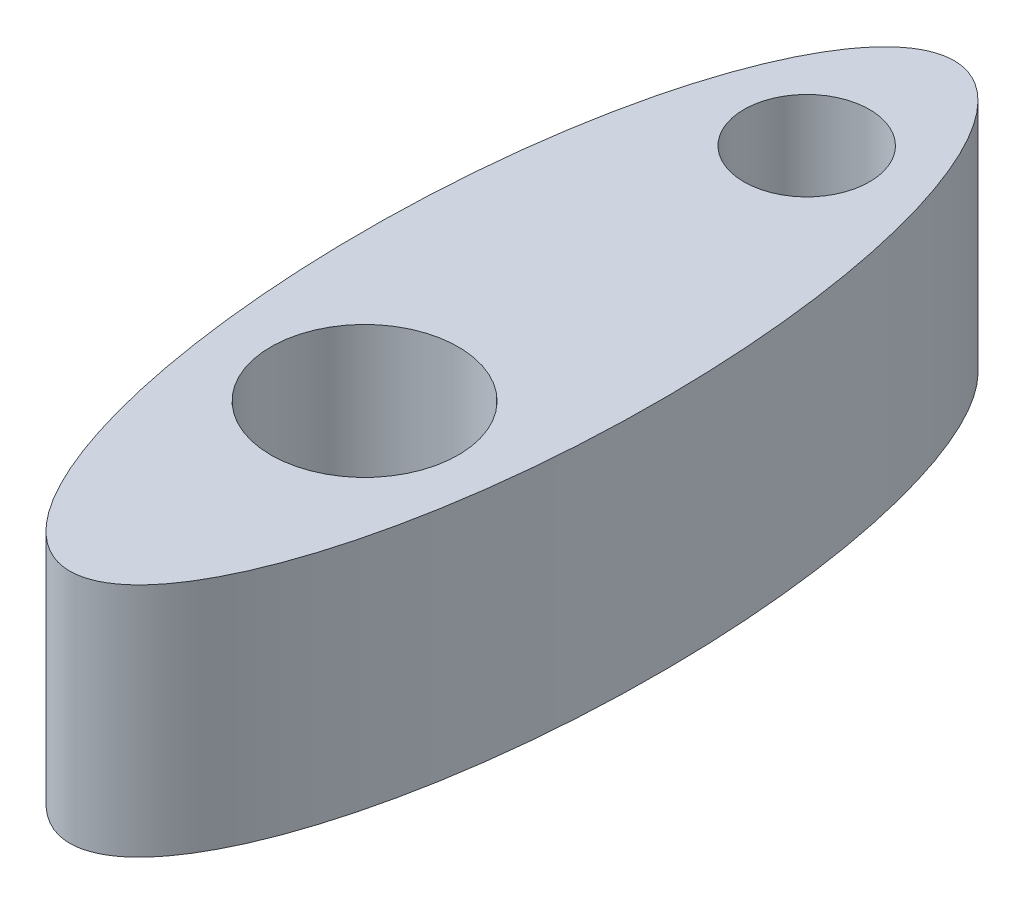
ISO-10303-21;
HEADER;
FILE_DESCRIPTION(('STEP AP214'),'2;1');
FILE_NAME('part.step','',(''),(''),'','','');
FILE_SCHEMA(('AUTOMOTIVE_DESIGN { 1 0 10303 214 1 1 1 1 }'));
ENDSEC;
DATA;
#1=APPLICATION_CONTEXT('core data for automotive mechanical design processes');
#2=APPLICATION_PROTOCOL_DEFINITION('international standard','automotive_design',2000,#1);
#3=PRODUCT_CONTEXT('',#1,'mechanical');
#4=PRODUCT('Part','Part','',(#3));
#5=PRODUCT_RELATED_PRODUCT_CATEGORY('part','',(#4));
#6=PRODUCT_DEFINITION_FORMATION('','',#4);
#7=PRODUCT_DEFINITION_CONTEXT('part definition',#1,'design');
#8=PRODUCT_DEFINITION('design','',#6,#7);
#9=PRODUCT_DEFINITION_SHAPE('','',#8);
#10=(LENGTH_UNIT() NAMED_UNIT(*) SI_UNIT(.MILLI.,.METRE.));
#11=(NAMED_UNIT(*) PLANE_ANGLE_UNIT() SI_UNIT($,.RADIAN.));
#12=(NAMED_UNIT(*) SI_UNIT($,.STERADIAN.) SOLID_ANGLE_UNIT());
#13=UNCERTAINTY_MEASURE_WITH_UNIT(LENGTH_MEASURE(1.E-05),#10,'distance_accuracy_value','');
#14=(GEOMETRIC_REPRESENTATION_CONTEXT(3) GLOBAL_UNCERTAINTY_ASSIGNED_CONTEXT((#13)) GLOBAL_UNIT_ASSIGNED_CONTEXT((#10,
#11,#12)) REPRESENTATION_CONTEXT('',''));
#15=CARTESIAN_POINT('',(0.,0.,0.));
#16=DIRECTION('',(0.,0.,1.));
#17=DIRECTION('',(1.,0.,0.));
#18=AXIS2_PLACEMENT_3D('',#15,#16,#17);
#19=CARTESIAN_POINT('',(0.,5.08,0.));
#20=DIRECTION('',(0.,1.,0.));
#21=DIRECTION('',(0.,0.,1.));
#22=AXIS2_PLACEMENT_3D('',#19,#20,#21);
#23=PLANE('',#22);
#24=CARTESIAN_POINT('',(0.,5.08,0.));
#25=DIRECTION('',(0.,1.,0.));
#26=DIRECTION('',(0.,0.,1.));
#27=AXIS2_PLACEMENT_3D('',#24,#25,#26);
#28=CIRCLE('',#27,2.01929999999999);
#29=CARTESIAN_POINT('',(0.,5.08,2.01929999999999));
#30=VERTEX_POINT('',#29);
#31=EDGE_CURVE('E41',#30,#30,#28,.T.);
#32=ORIENTED_EDGE('',*,*,#31,.F.);
#33=EDGE_LOOP('',(#32));
#34=FACE_BOUND('',#33,.T.);
#35=CARTESIAN_POINT('',(0.,5.08,-9.525));
#36=DIRECTION('',(0.,1.,0.));
#37=DIRECTION('',(0.,0.,1.));
#38=AXIS2_PLACEMENT_3D('',#35,#36,#37);
#39=CIRCLE('',#38,1.35255);
#40=CARTESIAN_POINT('',(0.,5.08,-8.17245));
#41=VERTEX_POINT('',#40);
#42=EDGE_CURVE('E49',#41,#41,#39,.T.);
#43=ORIENTED_EDGE('',*,*,#42,.F.);
#44=EDGE_LOOP('',(#43));
#45=FACE_BOUND('',#44,.T.);
#46=CARTESIAN_POINT('',(0.,5.08,-3.175));
#47=DIRECTION('',(0.,1.,0.));
#48=DIRECTION('',(0.,0.,1.));
#49=AXIS2_PLACEMENT_3D('',#46,#47,#48);
#50=ELLIPSE('',#49,9.525,3.175);
#51=CARTESIAN_POINT('',(0.,5.08,6.35));
#52=VERTEX_POINT('',#51);
#53=EDGE_CURVE('E55',#52,#52,#50,.T.);
#54=ORIENTED_EDGE('',*,*,#53,.T.);
#55=EDGE_LOOP('',(#54));
#56=FACE_BOUND('',#55,.T.);
#57=ADVANCED_FACE('F34',(#34,#45,#56),#23,.T.);
#58=CARTESIAN_POINT('',(0.,0.,0.));
#59=DIRECTION('',(0.,1.,0.));
#60=DIRECTION('',(0.,0.,1.));
#61=AXIS2_PLACEMENT_3D('',#58,#59,#60);
#62=PLANE('',#61);
#63=CARTESIAN_POINT('',(0.,0.,0.));
#64=DIRECTION('',(0.,1.,0.));
#65=DIRECTION('',(0.,0.,1.));
#66=AXIS2_PLACEMENT_3D('',#63,#64,#65);
#67=CIRCLE('',#66,2.01929999999999);
#68=CARTESIAN_POINT('',(0.,0.,2.01929999999999));
#69=VERTEX_POINT('',#68);
#70=EDGE_CURVE('E11',#69,#69,#67,.T.);
#71=ORIENTED_EDGE('',*,*,#70,.T.);
#72=EDGE_LOOP('',(#71));
#73=FACE_BOUND('',#72,.T.);
#74=CARTESIAN_POINT('',(0.,0.,-9.525));
#75=DIRECTION('',(0.,1.,0.));
#76=DIRECTION('',(0.,0.,1.));
#77=AXIS2_PLACEMENT_3D('',#74,#75,#76);
#78=CIRCLE('',#77,1.35255);
#79=CARTESIAN_POINT('',(0.,0.,-8.17245));
#80=VERTEX_POINT('',#79);
#81=EDGE_CURVE('E45',#80,#80,#78,.T.);
#82=ORIENTED_EDGE('',*,*,#81,.T.);
#83=EDGE_LOOP('',(#82));
#84=FACE_BOUND('',#83,.T.);
#85=CARTESIAN_POINT('',(0.,0.,-3.175));
#86=DIRECTION('',(0.,1.,0.));
#87=DIRECTION('',(0.,0.,1.));
#88=AXIS2_PLACEMENT_3D('',#85,#86,#87);
#89=ELLIPSE('',#88,9.525,3.175);
#90=CARTESIAN_POINT('',(0.,0.,6.35));
#91=VERTEX_POINT('',#90);
#92=EDGE_CURVE('E54',#91,#91,#89,.T.);
#93=ORIENTED_EDGE('',*,*,#92,.F.);
#94=EDGE_LOOP('',(#93));
#95=FACE_BOUND('',#94,.T.);
#96=ADVANCED_FACE('F36',(#73,#84,#95),#62,.F.);
#97=CARTESIAN_POINT('',(0.,5.08,0.));
#98=DIRECTION('',(0.,1.,0.));
#99=DIRECTION('',(0.,0.,1.));
#100=AXIS2_PLACEMENT_3D('',#97,#98,#99);
#101=CYLINDRICAL_SURFACE('',#100,2.01929999999999);
#102=ORIENTED_EDGE('',*,*,#70,.F.);
#103=EDGE_LOOP('',(#102));
#104=FACE_BOUND('',#103,.T.);
#105=ORIENTED_EDGE('',*,*,#31,.T.);
#106=EDGE_LOOP('',(#105));
#107=FACE_BOUND('',#106,.T.);
#108=ADVANCED_FACE('F68',(#104,#107),#101,.F.);
#109=CARTESIAN_POINT('',(0.,5.08,-9.525));
#110=DIRECTION('',(0.,1.,0.));
#111=DIRECTION('',(0.,0.,1.));
#112=AXIS2_PLACEMENT_3D('',#109,#110,#111);
#113=CYLINDRICAL_SURFACE('',#112,1.35255);
#114=ORIENTED_EDGE('',*,*,#81,.F.);
#115=EDGE_LOOP('',(#114));
#116=FACE_BOUND('',#115,.T.);
#117=ORIENTED_EDGE('',*,*,#42,.T.);
#118=EDGE_LOOP('',(#117));
#119=FACE_BOUND('',#118,.T.);
#120=ADVANCED_FACE('F64',(#116,#119),#113,.F.);
#121=DIRECTION('',(0.,1.,0.));
#122=VECTOR('',#121,1.);
#123=SURFACE_OF_LINEAR_EXTRUSION('',#89,#122);
#124=ORIENTED_EDGE('',*,*,#92,.T.);
#125=EDGE_LOOP('',(#124));
#126=FACE_BOUND('',#125,.T.);
#127=ORIENTED_EDGE('',*,*,#53,.F.);
#128=EDGE_LOOP('',(#127));
#129=FACE_BOUND('',#128,.T.);
#130=ADVANCED_FACE('F61',(#126,#129),#123,.T.);
#131=CLOSED_SHELL('',(#57,#96,#108,#120,#130));
#132=MANIFOLD_SOLID_BREP('B2',#131);
#133=ADVANCED_BREP_SHAPE_REPRESENTATION('',(#18,#132),#14);
#134=SHAPE_DEFINITION_REPRESENTATION(#9,#133);
ENDSEC;
END-ISO-10303-21;
